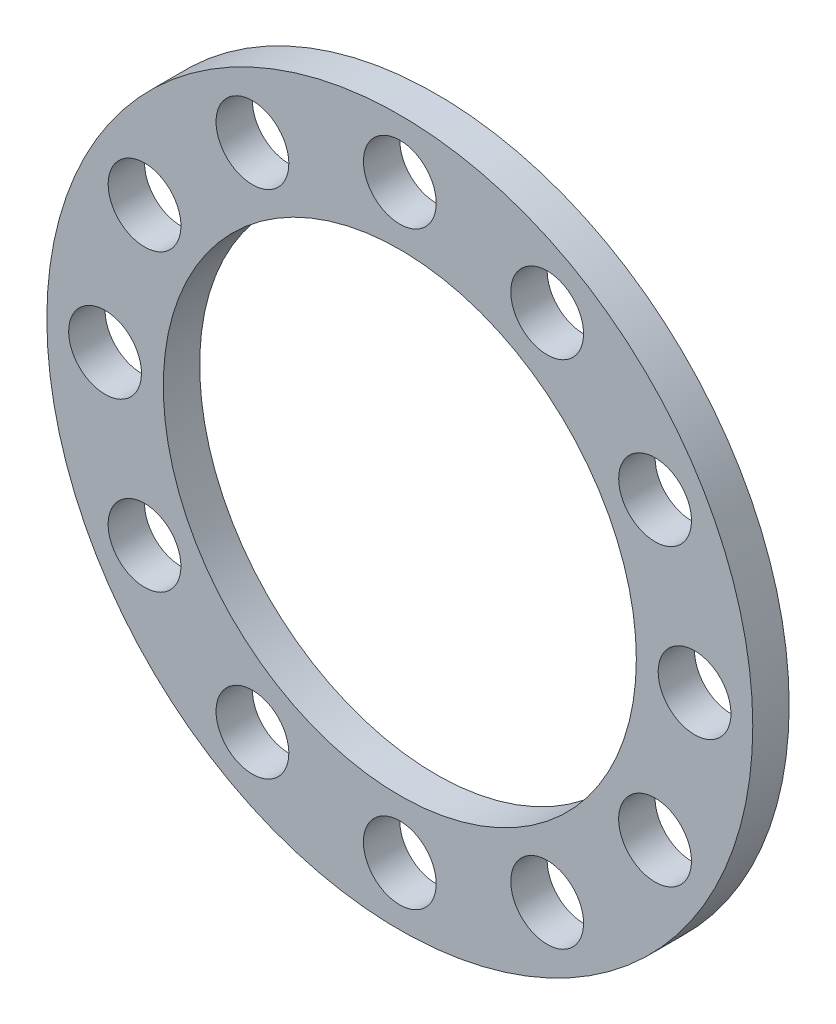
ISO-10303-21;
HEADER;
FILE_DESCRIPTION(('STEP AP214'),'2;1');
FILE_NAME('part.step','',(''),(''),'','','');
FILE_SCHEMA(('AUTOMOTIVE_DESIGN { 1 0 10303 214 1 1 1 1 }'));
ENDSEC;
DATA;
#1=APPLICATION_CONTEXT('core data for automotive mechanical design processes');
#2=APPLICATION_PROTOCOL_DEFINITION('international standard','automotive_design',2000,#1);
#3=PRODUCT_CONTEXT('',#1,'mechanical');
#4=PRODUCT('Part','Part','',(#3));
#5=PRODUCT_RELATED_PRODUCT_CATEGORY('part','',(#4));
#6=PRODUCT_DEFINITION_FORMATION('','',#4);
#7=PRODUCT_DEFINITION_CONTEXT('part definition',#1,'design');
#8=PRODUCT_DEFINITION('design','',#6,#7);
#9=PRODUCT_DEFINITION_SHAPE('','',#8);
#10=(LENGTH_UNIT() NAMED_UNIT(*) SI_UNIT(.MILLI.,.METRE.));
#11=(NAMED_UNIT(*) PLANE_ANGLE_UNIT() SI_UNIT($,.RADIAN.));
#12=(NAMED_UNIT(*) SI_UNIT($,.STERADIAN.) SOLID_ANGLE_UNIT());
#13=UNCERTAINTY_MEASURE_WITH_UNIT(LENGTH_MEASURE(1.E-05),#10,'distance_accuracy_value','');
#14=(GEOMETRIC_REPRESENTATION_CONTEXT(3) GLOBAL_UNCERTAINTY_ASSIGNED_CONTEXT((#13)) GLOBAL_UNIT_ASSIGNED_CONTEXT((#10,
#11,#12)) REPRESENTATION_CONTEXT('',''));
#15=CARTESIAN_POINT('',(0.,0.,0.));
#16=DIRECTION('',(0.,0.,1.));
#17=DIRECTION('',(1.,0.,0.));
#18=AXIS2_PLACEMENT_3D('',#15,#16,#17);
#19=CARTESIAN_POINT('',(0.,0.,5.));
#20=DIRECTION('',(0.,0.,1.));
#21=DIRECTION('',(1.,0.,0.));
#22=AXIS2_PLACEMENT_3D('',#19,#20,#21);
#23=PLANE('',#22);
#24=CARTESIAN_POINT('',(-35.0740288532698,20.2499999999999,5.));
#25=DIRECTION('',(0.,0.,1.));
#26=DIRECTION('',(0.499999999999998,0.86602540378444,0.));
#27=AXIS2_PLACEMENT_3D('',#24,#25,#26);
#28=CIRCLE('',#27,5.);
#29=CARTESIAN_POINT('',(-32.5740288532698,24.5801270189221,5.));
#30=VERTEX_POINT('',#29);
#31=EDGE_CURVE('E108',#30,#30,#28,.T.);
#32=ORIENTED_EDGE('',*,*,#31,.F.);
#33=EDGE_LOOP('',(#32));
#34=FACE_BOUND('',#33,.T.);
#35=CARTESIAN_POINT('',(-40.5,-1.41404994223147E-13,5.));
#36=DIRECTION('',(0.,0.,1.));
#37=DIRECTION('',(0.,1.,0.));
#38=AXIS2_PLACEMENT_3D('',#35,#36,#37);
#39=CIRCLE('',#38,5.);
#40=CARTESIAN_POINT('',(-40.5,4.99999999999986,5.));
#41=VERTEX_POINT('',#40);
#42=EDGE_CURVE('E102',#41,#41,#39,.T.);
#43=ORIENTED_EDGE('',*,*,#42,.F.);
#44=EDGE_LOOP('',(#43));
#45=FACE_BOUND('',#44,.T.);
#46=CARTESIAN_POINT('',(-35.0740288532697,-20.2500000000002,5.));
#47=DIRECTION('',(0.,0.,1.));
#48=DIRECTION('',(-0.500000000000004,0.866025403784436,0.));
#49=AXIS2_PLACEMENT_3D('',#46,#47,#48);
#50=CIRCLE('',#49,5.);
#51=CARTESIAN_POINT('',(-37.5740288532697,-15.919872981078,5.));
#52=VERTEX_POINT('',#51);
#53=EDGE_CURVE('E96',#52,#52,#50,.T.);
#54=ORIENTED_EDGE('',*,*,#53,.F.);
#55=EDGE_LOOP('',(#54));
#56=FACE_BOUND('',#55,.T.);
#57=CARTESIAN_POINT('',(-20.2499999999998,-35.0740288532699,5.));
#58=DIRECTION('',(0.,0.,1.));
#59=DIRECTION('',(-0.866025403784442,0.499999999999995,0.));
#60=AXIS2_PLACEMENT_3D('',#57,#58,#59);
#61=CIRCLE('',#60,5.);
#62=CARTESIAN_POINT('',(-24.580127018922,-32.5740288532699,5.));
#63=VERTEX_POINT('',#62);
#64=EDGE_CURVE('E90',#63,#63,#61,.T.);
#65=ORIENTED_EDGE('',*,*,#64,.F.);
#66=EDGE_LOOP('',(#65));
#67=FACE_BOUND('',#66,.T.);
#68=CARTESIAN_POINT('',(0.,-40.5,5.));
#69=DIRECTION('',(0.,0.,1.));
#70=DIRECTION('',(-1.,0.,0.));
#71=AXIS2_PLACEMENT_3D('',#68,#69,#70);
#72=CIRCLE('',#71,5.);
#73=CARTESIAN_POINT('',(-5.,-40.5,5.));
#74=VERTEX_POINT('',#73);
#75=EDGE_CURVE('E84',#74,#74,#72,.T.);
#76=ORIENTED_EDGE('',*,*,#75,.F.);
#77=EDGE_LOOP('',(#76));
#78=FACE_BOUND('',#77,.T.);
#79=CARTESIAN_POINT('',(20.2500000000003,-35.0740288532696,5.));
#80=DIRECTION('',(0.,0.,1.));
#81=DIRECTION('',(-0.866025403784435,-0.500000000000007,0.));
#82=AXIS2_PLACEMENT_3D('',#79,#80,#81);
#83=CIRCLE('',#82,5.);
#84=CARTESIAN_POINT('',(15.9198729810781,-37.5740288532696,5.));
#85=VERTEX_POINT('',#84);
#86=EDGE_CURVE('E78',#85,#85,#83,.T.);
#87=ORIENTED_EDGE('',*,*,#86,.F.);
#88=EDGE_LOOP('',(#87));
#89=FACE_BOUND('',#88,.T.);
#90=CARTESIAN_POINT('',(35.07402885327,-20.2499999999997,5.));
#91=DIRECTION('',(0.,0.,1.));
#92=DIRECTION('',(-0.499999999999992,-0.866025403784443,0.));
#93=AXIS2_PLACEMENT_3D('',#90,#91,#92);
#94=CIRCLE('',#93,5.);
#95=CARTESIAN_POINT('',(32.57402885327,-24.5801270189219,5.));
#96=VERTEX_POINT('',#95);
#97=EDGE_CURVE('E72',#96,#96,#94,.T.);
#98=ORIENTED_EDGE('',*,*,#97,.F.);
#99=EDGE_LOOP('',(#98));
#100=FACE_BOUND('',#99,.T.);
#101=CARTESIAN_POINT('',(40.5,4.24214982669441E-13,5.));
#102=DIRECTION('',(0.,0.,1.));
#103=DIRECTION('',(0.,-1.,0.));
#104=AXIS2_PLACEMENT_3D('',#101,#102,#103);
#105=CIRCLE('',#104,5.);
#106=CARTESIAN_POINT('',(40.5000000000001,-4.99999999999958,5.));
#107=VERTEX_POINT('',#106);
#108=EDGE_CURVE('E65',#107,#107,#105,.T.);
#109=ORIENTED_EDGE('',*,*,#108,.F.);
#110=EDGE_LOOP('',(#109));
#111=FACE_BOUND('',#110,.T.);
#112=CARTESIAN_POINT('',(35.0740288532695,20.2500000000004,5.));
#113=DIRECTION('',(0.,0.,1.));
#114=DIRECTION('',(0.50000000000001,-0.866025403784433,0.));
#115=AXIS2_PLACEMENT_3D('',#112,#113,#114);
#116=CIRCLE('',#115,5.);
#117=CARTESIAN_POINT('',(37.5740288532696,15.9198729810782,5.));
#118=VERTEX_POINT('',#117);
#119=EDGE_CURVE('E119',#118,#118,#116,.T.);
#120=ORIENTED_EDGE('',*,*,#119,.F.);
#121=EDGE_LOOP('',(#120));
#122=FACE_BOUND('',#121,.T.);
#123=CARTESIAN_POINT('',(20.2499999999995,35.07402885327,5.));
#124=DIRECTION('',(0.,0.,1.));
#125=DIRECTION('',(0.866025403784445,-0.499999999999989,0.));
#126=AXIS2_PLACEMENT_3D('',#123,#124,#125);
#127=CIRCLE('',#126,5.);
#128=CARTESIAN_POINT('',(24.5801270189218,32.5740288532701,5.));
#129=VERTEX_POINT('',#128);
#130=EDGE_CURVE('E113',#129,#129,#127,.T.);
#131=ORIENTED_EDGE('',*,*,#130,.F.);
#132=EDGE_LOOP('',(#131));
#133=FACE_BOUND('',#132,.T.);
#134=CARTESIAN_POINT('',(-20.25,35.0740288532697,5.));
#135=DIRECTION('',(0.,0.,1.));
#136=DIRECTION('',(0.866025403784438,0.500000000000001,0.));
#137=AXIS2_PLACEMENT_3D('',#134,#135,#136);
#138=CIRCLE('',#137,5.);
#139=CARTESIAN_POINT('',(-15.9198729810779,37.5740288532697,5.));
#140=VERTEX_POINT('',#139);
#141=EDGE_CURVE('E59',#140,#140,#138,.T.);
#142=ORIENTED_EDGE('',*,*,#141,.F.);
#143=EDGE_LOOP('',(#142));
#144=FACE_BOUND('',#143,.T.);
#145=CARTESIAN_POINT('',(0.,40.5,5.));
#146=DIRECTION('',(0.,0.,1.));
#147=DIRECTION('',(1.,0.,0.));
#148=AXIS2_PLACEMENT_3D('',#145,#146,#147);
#149=CIRCLE('',#148,5.);
#150=CARTESIAN_POINT('',(5.,40.5,5.));
#151=VERTEX_POINT('',#150);
#152=EDGE_CURVE('E53',#151,#151,#149,.T.);
#153=ORIENTED_EDGE('',*,*,#152,.F.);
#154=EDGE_LOOP('',(#153));
#155=FACE_BOUND('',#154,.T.);
#156=CARTESIAN_POINT('',(0.,0.,5.));
#157=DIRECTION('',(0.,0.,1.));
#158=DIRECTION('',(1.,0.,0.));
#159=AXIS2_PLACEMENT_3D('',#156,#157,#158);
#160=CIRCLE('',#159,48.5);
#161=CARTESIAN_POINT('',(48.5,0.,5.));
#162=VERTEX_POINT('',#161);
#163=EDGE_CURVE('E10',#162,#162,#160,.T.);
#164=ORIENTED_EDGE('',*,*,#163,.T.);
#165=EDGE_LOOP('',(#164));
#166=FACE_BOUND('',#165,.T.);
#167=CARTESIAN_POINT('',(0.,0.,5.));
#168=DIRECTION('',(0.,0.,1.));
#169=DIRECTION('',(1.,0.,0.));
#170=AXIS2_PLACEMENT_3D('',#167,#168,#169);
#171=CIRCLE('',#170,32.5);
#172=CARTESIAN_POINT('',(32.5,0.,5.));
#173=VERTEX_POINT('',#172);
#174=EDGE_CURVE('E45',#173,#173,#171,.T.);
#175=ORIENTED_EDGE('',*,*,#174,.F.);
#176=EDGE_LOOP('',(#175));
#177=FACE_BOUND('',#176,.T.);
#178=ADVANCED_FACE('F34',(#34,#45,#56,#67,#78,#89,#100,#111,#122,#133,#144,#155,#166,#177),#23,.T.);
#179=CARTESIAN_POINT('',(0.,0.,0.));
#180=DIRECTION('',(0.,0.,1.));
#181=DIRECTION('',(1.,0.,0.));
#182=AXIS2_PLACEMENT_3D('',#179,#180,#181);
#183=PLANE('',#182);
#184=CARTESIAN_POINT('',(-35.0740288532698,20.2499999999999,0.));
#185=DIRECTION('',(0.,0.,1.));
#186=DIRECTION('',(0.499999999999998,0.86602540378444,0.));
#187=AXIS2_PLACEMENT_3D('',#184,#185,#186);
#188=CIRCLE('',#187,5.);
#189=CARTESIAN_POINT('',(-32.5740288532698,24.5801270189221,0.));
#190=VERTEX_POINT('',#189);
#191=EDGE_CURVE('E62',#190,#190,#188,.T.);
#192=ORIENTED_EDGE('',*,*,#191,.T.);
#193=EDGE_LOOP('',(#192));
#194=FACE_BOUND('',#193,.T.);
#195=CARTESIAN_POINT('',(-40.5,-1.41404994223147E-13,0.));
#196=DIRECTION('',(0.,0.,1.));
#197=DIRECTION('',(0.,1.,0.));
#198=AXIS2_PLACEMENT_3D('',#195,#196,#197);
#199=CIRCLE('',#198,5.);
#200=CARTESIAN_POINT('',(-40.5,4.99999999999986,0.));
#201=VERTEX_POINT('',#200);
#202=EDGE_CURVE('E105',#201,#201,#199,.T.);
#203=ORIENTED_EDGE('',*,*,#202,.T.);
#204=EDGE_LOOP('',(#203));
#205=FACE_BOUND('',#204,.T.);
#206=CARTESIAN_POINT('',(-35.0740288532697,-20.2500000000002,0.));
#207=DIRECTION('',(0.,0.,1.));
#208=DIRECTION('',(-0.500000000000004,0.866025403784436,0.));
#209=AXIS2_PLACEMENT_3D('',#206,#207,#208);
#210=CIRCLE('',#209,5.);
#211=CARTESIAN_POINT('',(-37.5740288532697,-15.919872981078,0.));
#212=VERTEX_POINT('',#211);
#213=EDGE_CURVE('E99',#212,#212,#210,.T.);
#214=ORIENTED_EDGE('',*,*,#213,.T.);
#215=EDGE_LOOP('',(#214));
#216=FACE_BOUND('',#215,.T.);
#217=CARTESIAN_POINT('',(-20.2499999999998,-35.0740288532699,0.));
#218=DIRECTION('',(0.,0.,1.));
#219=DIRECTION('',(-0.866025403784442,0.499999999999995,0.));
#220=AXIS2_PLACEMENT_3D('',#217,#218,#219);
#221=CIRCLE('',#220,5.);
#222=CARTESIAN_POINT('',(-24.580127018922,-32.5740288532699,0.));
#223=VERTEX_POINT('',#222);
#224=EDGE_CURVE('E93',#223,#223,#221,.T.);
#225=ORIENTED_EDGE('',*,*,#224,.T.);
#226=EDGE_LOOP('',(#225));
#227=FACE_BOUND('',#226,.T.);
#228=CARTESIAN_POINT('',(0.,-40.5,0.));
#229=DIRECTION('',(0.,0.,1.));
#230=DIRECTION('',(-1.,0.,0.));
#231=AXIS2_PLACEMENT_3D('',#228,#229,#230);
#232=CIRCLE('',#231,5.);
#233=CARTESIAN_POINT('',(-5.,-40.5,0.));
#234=VERTEX_POINT('',#233);
#235=EDGE_CURVE('E87',#234,#234,#232,.T.);
#236=ORIENTED_EDGE('',*,*,#235,.T.);
#237=EDGE_LOOP('',(#236));
#238=FACE_BOUND('',#237,.T.);
#239=CARTESIAN_POINT('',(20.2500000000003,-35.0740288532696,0.));
#240=DIRECTION('',(0.,0.,1.));
#241=DIRECTION('',(-0.866025403784435,-0.500000000000007,0.));
#242=AXIS2_PLACEMENT_3D('',#239,#240,#241);
#243=CIRCLE('',#242,5.);
#244=CARTESIAN_POINT('',(15.9198729810781,-37.5740288532696,0.));
#245=VERTEX_POINT('',#244);
#246=EDGE_CURVE('E81',#245,#245,#243,.T.);
#247=ORIENTED_EDGE('',*,*,#246,.T.);
#248=EDGE_LOOP('',(#247));
#249=FACE_BOUND('',#248,.T.);
#250=CARTESIAN_POINT('',(35.07402885327,-20.2499999999997,0.));
#251=DIRECTION('',(0.,0.,1.));
#252=DIRECTION('',(-0.499999999999992,-0.866025403784443,0.));
#253=AXIS2_PLACEMENT_3D('',#250,#251,#252);
#254=CIRCLE('',#253,5.);
#255=CARTESIAN_POINT('',(32.57402885327,-24.5801270189219,0.));
#256=VERTEX_POINT('',#255);
#257=EDGE_CURVE('E75',#256,#256,#254,.T.);
#258=ORIENTED_EDGE('',*,*,#257,.T.);
#259=EDGE_LOOP('',(#258));
#260=FACE_BOUND('',#259,.T.);
#261=CARTESIAN_POINT('',(40.5,4.24214982669441E-13,0.));
#262=DIRECTION('',(0.,0.,1.));
#263=DIRECTION('',(0.,-1.,0.));
#264=AXIS2_PLACEMENT_3D('',#261,#262,#263);
#265=CIRCLE('',#264,5.);
#266=CARTESIAN_POINT('',(40.5000000000001,-4.99999999999958,0.));
#267=VERTEX_POINT('',#266);
#268=EDGE_CURVE('E68',#267,#267,#265,.T.);
#269=ORIENTED_EDGE('',*,*,#268,.T.);
#270=EDGE_LOOP('',(#269));
#271=FACE_BOUND('',#270,.T.);
#272=CARTESIAN_POINT('',(35.0740288532695,20.2500000000004,0.));
#273=DIRECTION('',(0.,0.,1.));
#274=DIRECTION('',(0.50000000000001,-0.866025403784433,0.));
#275=AXIS2_PLACEMENT_3D('',#272,#273,#274);
#276=CIRCLE('',#275,5.);
#277=CARTESIAN_POINT('',(37.5740288532696,15.9198729810782,0.));
#278=VERTEX_POINT('',#277);
#279=EDGE_CURVE('E69',#278,#278,#276,.T.);
#280=ORIENTED_EDGE('',*,*,#279,.T.);
#281=EDGE_LOOP('',(#280));
#282=FACE_BOUND('',#281,.T.);
#283=CARTESIAN_POINT('',(20.2499999999995,35.07402885327,0.));
#284=DIRECTION('',(0.,0.,1.));
#285=DIRECTION('',(0.866025403784445,-0.499999999999989,0.));
#286=AXIS2_PLACEMENT_3D('',#283,#284,#285);
#287=CIRCLE('',#286,5.);
#288=CARTESIAN_POINT('',(24.5801270189218,32.5740288532701,0.));
#289=VERTEX_POINT('',#288);
#290=EDGE_CURVE('E116',#289,#289,#287,.T.);
#291=ORIENTED_EDGE('',*,*,#290,.T.);
#292=EDGE_LOOP('',(#291));
#293=FACE_BOUND('',#292,.T.);
#294=CARTESIAN_POINT('',(-20.25,35.0740288532697,0.));
#295=DIRECTION('',(0.,0.,1.));
#296=DIRECTION('',(0.866025403784438,0.500000000000001,0.));
#297=AXIS2_PLACEMENT_3D('',#294,#295,#296);
#298=CIRCLE('',#297,5.);
#299=CARTESIAN_POINT('',(-15.9198729810779,37.5740288532697,0.));
#300=VERTEX_POINT('',#299);
#301=EDGE_CURVE('E56',#300,#300,#298,.T.);
#302=ORIENTED_EDGE('',*,*,#301,.T.);
#303=EDGE_LOOP('',(#302));
#304=FACE_BOUND('',#303,.T.);
#305=CARTESIAN_POINT('',(0.,40.5,0.));
#306=DIRECTION('',(0.,0.,1.));
#307=DIRECTION('',(1.,0.,0.));
#308=AXIS2_PLACEMENT_3D('',#305,#306,#307);
#309=CIRCLE('',#308,5.);
#310=CARTESIAN_POINT('',(5.,40.5,0.));
#311=VERTEX_POINT('',#310);
#312=EDGE_CURVE('E50',#311,#311,#309,.T.);
#313=ORIENTED_EDGE('',*,*,#312,.T.);
#314=EDGE_LOOP('',(#313));
#315=FACE_BOUND('',#314,.T.);
#316=CARTESIAN_POINT('',(0.,0.,0.));
#317=DIRECTION('',(0.,0.,1.));
#318=DIRECTION('',(1.,0.,0.));
#319=AXIS2_PLACEMENT_3D('',#316,#317,#318);
#320=CIRCLE('',#319,48.5);
#321=CARTESIAN_POINT('',(48.5,0.,0.));
#322=VERTEX_POINT('',#321);
#323=EDGE_CURVE('E38',#322,#322,#320,.T.);
#324=ORIENTED_EDGE('',*,*,#323,.F.);
#325=EDGE_LOOP('',(#324));
#326=FACE_BOUND('',#325,.T.);
#327=CARTESIAN_POINT('',(0.,0.,0.));
#328=DIRECTION('',(0.,0.,1.));
#329=DIRECTION('',(1.,0.,0.));
#330=AXIS2_PLACEMENT_3D('',#327,#328,#329);
#331=CIRCLE('',#330,32.5);
#332=CARTESIAN_POINT('',(32.5,0.,0.));
#333=VERTEX_POINT('',#332);
#334=EDGE_CURVE('E47',#333,#333,#331,.T.);
#335=ORIENTED_EDGE('',*,*,#334,.T.);
#336=EDGE_LOOP('',(#335));
#337=FACE_BOUND('',#336,.T.);
#338=ADVANCED_FACE('F125',(#194,#205,#216,#227,#238,#249,#260,#271,#282,#293,#304,#315,#326,
#337),#183,.F.);
#339=CARTESIAN_POINT('',(0.,0.,5.));
#340=DIRECTION('',(0.,0.,-1.));
#341=DIRECTION('',(-1.,0.,0.));
#342=AXIS2_PLACEMENT_3D('',#339,#340,#341);
#343=CYLINDRICAL_SURFACE('',#342,48.5);
#344=ORIENTED_EDGE('',*,*,#163,.F.);
#345=EDGE_LOOP('',(#344));
#346=FACE_BOUND('',#345,.T.);
#347=ORIENTED_EDGE('',*,*,#323,.T.);
#348=EDGE_LOOP('',(#347));
#349=FACE_BOUND('',#348,.T.);
#350=ADVANCED_FACE('F36',(#346,#349),#343,.T.);
#351=CARTESIAN_POINT('',(0.,0.,5.));
#352=DIRECTION('',(0.,0.,-1.));
#353=DIRECTION('',(-1.,0.,0.));
#354=AXIS2_PLACEMENT_3D('',#351,#352,#353);
#355=CYLINDRICAL_SURFACE('',#354,32.5);
#356=ORIENTED_EDGE('',*,*,#174,.T.);
#357=EDGE_LOOP('',(#356));
#358=FACE_BOUND('',#357,.T.);
#359=ORIENTED_EDGE('',*,*,#334,.F.);
#360=EDGE_LOOP('',(#359));
#361=FACE_BOUND('',#360,.T.);
#362=ADVANCED_FACE('F148',(#358,#361),#355,.F.);
#363=CARTESIAN_POINT('',(0.,40.5,0.));
#364=DIRECTION('',(0.,0.,1.));
#365=DIRECTION('',(1.,0.,0.));
#366=AXIS2_PLACEMENT_3D('',#363,#364,#365);
#367=CYLINDRICAL_SURFACE('',#366,5.);
#368=ORIENTED_EDGE('',*,*,#312,.F.);
#369=EDGE_LOOP('',(#368));
#370=FACE_BOUND('',#369,.T.);
#371=ORIENTED_EDGE('',*,*,#152,.T.);
#372=EDGE_LOOP('',(#371));
#373=FACE_BOUND('',#372,.T.);
#374=ADVANCED_FACE('F151',(#370,#373),#367,.F.);
#375=CARTESIAN_POINT('',(-20.25,35.0740288532697,0.));
#376=DIRECTION('',(0.,0.,1.));
#377=DIRECTION('',(1.,0.,0.));
#378=AXIS2_PLACEMENT_3D('',#375,#376,#377);
#379=CYLINDRICAL_SURFACE('',#378,5.);
#380=ORIENTED_EDGE('',*,*,#301,.F.);
#381=EDGE_LOOP('',(#380));
#382=FACE_BOUND('',#381,.T.);
#383=ORIENTED_EDGE('',*,*,#141,.T.);
#384=EDGE_LOOP('',(#383));
#385=FACE_BOUND('',#384,.T.);
#386=ADVANCED_FACE('F165',(#382,#385),#379,.F.);
#387=CARTESIAN_POINT('',(20.2499999999995,35.07402885327,0.));
#388=DIRECTION('',(0.,0.,1.));
#389=DIRECTION('',(1.,0.,0.));
#390=AXIS2_PLACEMENT_3D('',#387,#388,#389);
#391=CYLINDRICAL_SURFACE('',#390,5.);
#392=ORIENTED_EDGE('',*,*,#290,.F.);
#393=EDGE_LOOP('',(#392));
#394=FACE_BOUND('',#393,.T.);
#395=ORIENTED_EDGE('',*,*,#130,.T.);
#396=EDGE_LOOP('',(#395));
#397=FACE_BOUND('',#396,.T.);
#398=ADVANCED_FACE('F132',(#394,#397),#391,.F.);
#399=CARTESIAN_POINT('',(35.0740288532695,20.2500000000004,0.));
#400=DIRECTION('',(0.,0.,1.));
#401=DIRECTION('',(1.,0.,0.));
#402=AXIS2_PLACEMENT_3D('',#399,#400,#401);
#403=CYLINDRICAL_SURFACE('',#402,5.);
#404=ORIENTED_EDGE('',*,*,#279,.F.);
#405=EDGE_LOOP('',(#404));
#406=FACE_BOUND('',#405,.T.);
#407=ORIENTED_EDGE('',*,*,#119,.T.);
#408=EDGE_LOOP('',(#407));
#409=FACE_BOUND('',#408,.T.);
#410=ADVANCED_FACE('F128',(#406,#409),#403,.F.);
#411=CARTESIAN_POINT('',(40.5,4.24214982669441E-13,0.));
#412=DIRECTION('',(0.,0.,1.));
#413=DIRECTION('',(1.,0.,0.));
#414=AXIS2_PLACEMENT_3D('',#411,#412,#413);
#415=CYLINDRICAL_SURFACE('',#414,5.);
#416=ORIENTED_EDGE('',*,*,#268,.F.);
#417=EDGE_LOOP('',(#416));
#418=FACE_BOUND('',#417,.T.);
#419=ORIENTED_EDGE('',*,*,#108,.T.);
#420=EDGE_LOOP('',(#419));
#421=FACE_BOUND('',#420,.T.);
#422=ADVANCED_FACE('F131',(#418,#421),#415,.F.);
#423=CARTESIAN_POINT('',(35.07402885327,-20.2499999999997,0.));
#424=DIRECTION('',(0.,0.,1.));
#425=DIRECTION('',(1.,0.,0.));
#426=AXIS2_PLACEMENT_3D('',#423,#424,#425);
#427=CYLINDRICAL_SURFACE('',#426,5.);
#428=ORIENTED_EDGE('',*,*,#257,.F.);
#429=EDGE_LOOP('',(#428));
#430=FACE_BOUND('',#429,.T.);
#431=ORIENTED_EDGE('',*,*,#97,.T.);
#432=EDGE_LOOP('',(#431));
#433=FACE_BOUND('',#432,.T.);
#434=ADVANCED_FACE('F172',(#430,#433),#427,.F.);
#435=CARTESIAN_POINT('',(20.2500000000003,-35.0740288532696,0.));
#436=DIRECTION('',(0.,0.,1.));
#437=DIRECTION('',(1.,0.,0.));
#438=AXIS2_PLACEMENT_3D('',#435,#436,#437);
#439=CYLINDRICAL_SURFACE('',#438,5.);
#440=ORIENTED_EDGE('',*,*,#246,.F.);
#441=EDGE_LOOP('',(#440));
#442=FACE_BOUND('',#441,.T.);
#443=ORIENTED_EDGE('',*,*,#86,.T.);
#444=EDGE_LOOP('',(#443));
#445=FACE_BOUND('',#444,.T.);
#446=ADVANCED_FACE('F176',(#442,#445),#439,.F.);
#447=CARTESIAN_POINT('',(0.,-40.5,0.));
#448=DIRECTION('',(0.,0.,1.));
#449=DIRECTION('',(1.,0.,0.));
#450=AXIS2_PLACEMENT_3D('',#447,#448,#449);
#451=CYLINDRICAL_SURFACE('',#450,5.);
#452=ORIENTED_EDGE('',*,*,#235,.F.);
#453=EDGE_LOOP('',(#452));
#454=FACE_BOUND('',#453,.T.);
#455=ORIENTED_EDGE('',*,*,#75,.T.);
#456=EDGE_LOOP('',(#455));
#457=FACE_BOUND('',#456,.T.);
#458=ADVANCED_FACE('F180',(#454,#457),#451,.F.);
#459=CARTESIAN_POINT('',(-20.2499999999998,-35.0740288532699,0.));
#460=DIRECTION('',(0.,0.,1.));
#461=DIRECTION('',(1.,0.,0.));
#462=AXIS2_PLACEMENT_3D('',#459,#460,#461);
#463=CYLINDRICAL_SURFACE('',#462,5.);
#464=ORIENTED_EDGE('',*,*,#224,.F.);
#465=EDGE_LOOP('',(#464));
#466=FACE_BOUND('',#465,.T.);
#467=ORIENTED_EDGE('',*,*,#64,.T.);
#468=EDGE_LOOP('',(#467));
#469=FACE_BOUND('',#468,.T.);
#470=ADVANCED_FACE('F184',(#466,#469),#463,.F.);
#471=CARTESIAN_POINT('',(-35.0740288532697,-20.2500000000002,0.));
#472=DIRECTION('',(0.,0.,1.));
#473=DIRECTION('',(1.,0.,0.));
#474=AXIS2_PLACEMENT_3D('',#471,#472,#473);
#475=CYLINDRICAL_SURFACE('',#474,5.);
#476=ORIENTED_EDGE('',*,*,#213,.F.);
#477=EDGE_LOOP('',(#476));
#478=FACE_BOUND('',#477,.T.);
#479=ORIENTED_EDGE('',*,*,#53,.T.);
#480=EDGE_LOOP('',(#479));
#481=FACE_BOUND('',#480,.T.);
#482=ADVANCED_FACE('F188',(#478,#481),#475,.F.);
#483=CARTESIAN_POINT('',(-40.5,-1.41404994223147E-13,0.));
#484=DIRECTION('',(0.,0.,1.));
#485=DIRECTION('',(1.,0.,0.));
#486=AXIS2_PLACEMENT_3D('',#483,#484,#485);
#487=CYLINDRICAL_SURFACE('',#486,5.);
#488=ORIENTED_EDGE('',*,*,#202,.F.);
#489=EDGE_LOOP('',(#488));
#490=FACE_BOUND('',#489,.T.);
#491=ORIENTED_EDGE('',*,*,#42,.T.);
#492=EDGE_LOOP('',(#491));
#493=FACE_BOUND('',#492,.T.);
#494=ADVANCED_FACE('F192',(#490,#493),#487,.F.);
#495=CARTESIAN_POINT('',(-35.0740288532698,20.2499999999999,0.));
#496=DIRECTION('',(0.,0.,1.));
#497=DIRECTION('',(1.,0.,0.));
#498=AXIS2_PLACEMENT_3D('',#495,#496,#497);
#499=CYLINDRICAL_SURFACE('',#498,5.);
#500=ORIENTED_EDGE('',*,*,#191,.F.);
#501=EDGE_LOOP('',(#500));
#502=FACE_BOUND('',#501,.T.);
#503=ORIENTED_EDGE('',*,*,#31,.T.);
#504=EDGE_LOOP('',(#503));
#505=FACE_BOUND('',#504,.T.);
#506=ADVANCED_FACE('F196',(#502,#505),#499,.F.);
#507=CLOSED_SHELL('',(#178,#338,#350,#362,#374,#386,#398,#410,#422,#434,#446,#458,#470,#482,
#494,#506));
#508=MANIFOLD_SOLID_BREP('B2',#507);
#509=ADVANCED_BREP_SHAPE_REPRESENTATION('',(#18,#508),#14);
#510=SHAPE_DEFINITION_REPRESENTATION(#9,#509);
ENDSEC;
END-ISO-10303-21;
